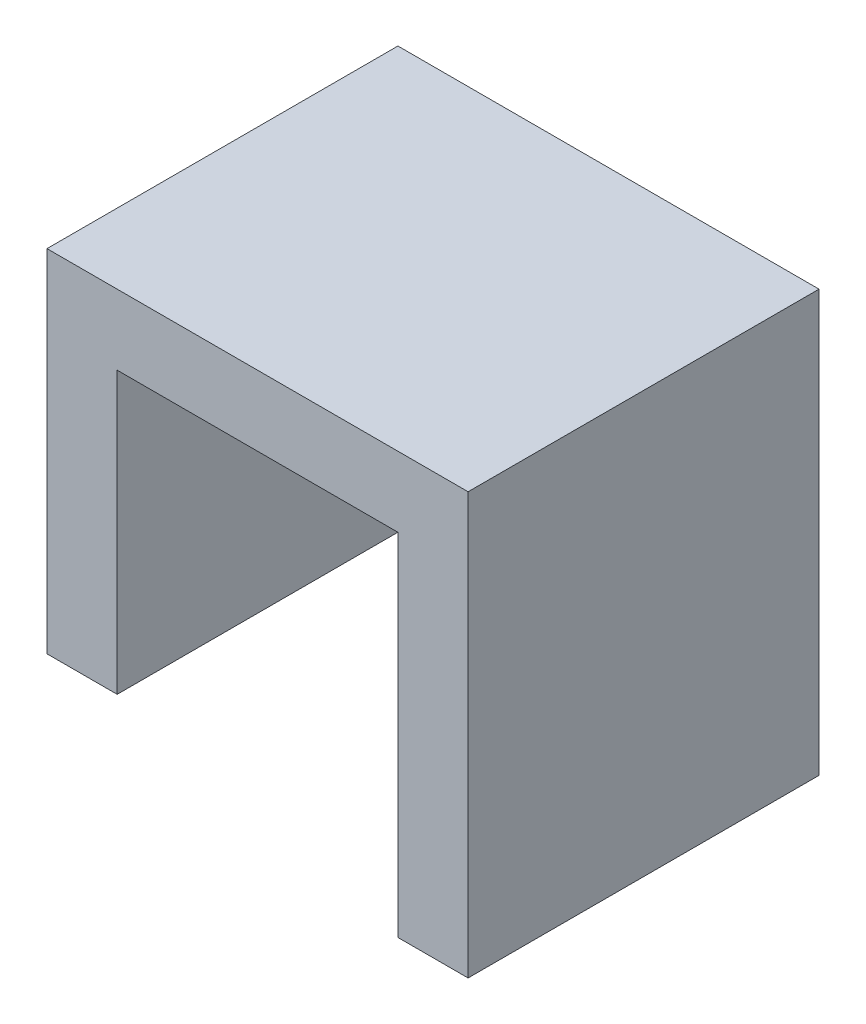
ISO-10303-21;
HEADER;
FILE_DESCRIPTION(('STEP AP214'),'2;1');
FILE_NAME('part.step','',(''),(''),'','','');
FILE_SCHEMA(('AUTOMOTIVE_DESIGN { 1 0 10303 214 1 1 1 1 }'));
ENDSEC;
DATA;
#1=APPLICATION_CONTEXT('core data for automotive mechanical design processes');
#2=APPLICATION_PROTOCOL_DEFINITION('international standard','automotive_design',2000,#1);
#3=PRODUCT_CONTEXT('',#1,'mechanical');
#4=PRODUCT('Part','Part','',(#3));
#5=PRODUCT_RELATED_PRODUCT_CATEGORY('part','',(#4));
#6=PRODUCT_DEFINITION_FORMATION('','',#4);
#7=PRODUCT_DEFINITION_CONTEXT('part definition',#1,'design');
#8=PRODUCT_DEFINITION('design','',#6,#7);
#9=PRODUCT_DEFINITION_SHAPE('','',#8);
#10=(LENGTH_UNIT() NAMED_UNIT(*) SI_UNIT(.MILLI.,.METRE.));
#11=(NAMED_UNIT(*) PLANE_ANGLE_UNIT() SI_UNIT($,.RADIAN.));
#12=(NAMED_UNIT(*) SI_UNIT($,.STERADIAN.) SOLID_ANGLE_UNIT());
#13=UNCERTAINTY_MEASURE_WITH_UNIT(LENGTH_MEASURE(1.E-05),#10,'distance_accuracy_value','');
#14=(GEOMETRIC_REPRESENTATION_CONTEXT(3) GLOBAL_UNCERTAINTY_ASSIGNED_CONTEXT((#13)) GLOBAL_UNIT_ASSIGNED_CONTEXT((#10,
#11,#12)) REPRESENTATION_CONTEXT('',''));
#15=CARTESIAN_POINT('',(0.,0.,0.));
#16=DIRECTION('',(0.,0.,1.));
#17=DIRECTION('',(1.,0.,0.));
#18=AXIS2_PLACEMENT_3D('',#15,#16,#17);
#19=CARTESIAN_POINT('',(8.87323943661972,8.,6.46478873239436));
#20=DIRECTION('',(0.,1.,0.));
#21=DIRECTION('',(0.,0.,1.));
#22=AXIS2_PLACEMENT_3D('',#19,#20,#21);
#23=PLANE('',#22);
#24=DIRECTION('',(0.,0.,-1.));
#25=VECTOR('',#24,1.);
#26=CARTESIAN_POINT('',(6.87323943661972,8.,6.46478873239436));
#27=LINE('',#26,#25);
#28=CARTESIAN_POINT('',(6.87323943661972,8.,6.46478873239436));
#29=VERTEX_POINT('',#28);
#30=CARTESIAN_POINT('',(6.87323943661972,8.,-3.53521126760564));
#31=VERTEX_POINT('',#30);
#32=EDGE_CURVE('E144',#29,#31,#27,.T.);
#33=ORIENTED_EDGE('',*,*,#32,.F.);
#34=DIRECTION('',(-1.,0.,0.));
#35=VECTOR('',#34,1.);
#36=CARTESIAN_POINT('',(8.87323943661972,8.,6.46478873239436));
#37=LINE('',#36,#35);
#38=CARTESIAN_POINT('',(-1.12676056338028,8.,6.46478873239436));
#39=VERTEX_POINT('',#38);
#40=EDGE_CURVE('E54',#29,#39,#37,.T.);
#41=ORIENTED_EDGE('',*,*,#40,.T.);
#42=DIRECTION('',(0.,0.,-1.));
#43=VECTOR('',#42,1.);
#44=CARTESIAN_POINT('',(-1.12676056338028,8.,6.46478873239436));
#45=LINE('',#44,#43);
#46=CARTESIAN_POINT('',(-1.12676056338029,8.,-3.53521126760564));
#47=VERTEX_POINT('',#46);
#48=EDGE_CURVE('E116',#39,#47,#45,.T.);
#49=ORIENTED_EDGE('',*,*,#48,.T.);
#50=DIRECTION('',(-1.,0.,0.));
#51=VECTOR('',#50,1.);
#52=CARTESIAN_POINT('',(8.87323943661971,8.,-3.53521126760564));
#53=LINE('',#52,#51);
#54=EDGE_CURVE('E107',#31,#47,#53,.T.);
#55=ORIENTED_EDGE('',*,*,#54,.F.);
#56=EDGE_LOOP('',(#33,#41,#49,#55));
#57=FACE_BOUND('',#56,.T.);
#58=ADVANCED_FACE('F39',(#57),#23,.F.);
#59=CARTESIAN_POINT('',(-1.12676056338029,10.,-3.53521126760564));
#60=DIRECTION('',(-1.,0.,0.));
#61=DIRECTION('',(0.,0.,1.));
#62=AXIS2_PLACEMENT_3D('',#59,#60,#61);
#63=PLANE('',#62);
#64=ORIENTED_EDGE('',*,*,#48,.F.);
#65=DIRECTION('',(0.,-1.,0.));
#66=VECTOR('',#65,1.);
#67=CARTESIAN_POINT('',(-1.12676056338028,10.,6.46478873239436));
#68=LINE('',#67,#66);
#69=CARTESIAN_POINT('',(-1.12676056338028,0.,6.46478873239436));
#70=VERTEX_POINT('',#69);
#71=EDGE_CURVE('E47',#39,#70,#68,.T.);
#72=ORIENTED_EDGE('',*,*,#71,.T.);
#73=DIRECTION('',(0.,0.,-1.));
#74=VECTOR('',#73,1.);
#75=CARTESIAN_POINT('',(-1.12676056338029,0.,-3.53521126760564));
#76=LINE('',#75,#74);
#77=CARTESIAN_POINT('',(-1.12676056338029,0.,-3.53521126760564));
#78=VERTEX_POINT('',#77);
#79=EDGE_CURVE('E95',#70,#78,#76,.T.);
#80=ORIENTED_EDGE('',*,*,#79,.T.);
#81=DIRECTION('',(0.,-1.,0.));
#82=VECTOR('',#81,1.);
#83=CARTESIAN_POINT('',(-1.12676056338029,10.,-3.53521126760564));
#84=LINE('',#83,#82);
#85=EDGE_CURVE('E89',#47,#78,#84,.T.);
#86=ORIENTED_EDGE('',*,*,#85,.F.);
#87=EDGE_LOOP('',(#64,#72,#80,#86));
#88=FACE_BOUND('',#87,.T.);
#89=ADVANCED_FACE('F115',(#88),#63,.F.);
#90=CARTESIAN_POINT('',(-3.12676056338029,10.,-3.53521126760564));
#91=DIRECTION('',(1.,0.,0.));
#92=DIRECTION('',(0.,0.,-1.));
#93=AXIS2_PLACEMENT_3D('',#90,#91,#92);
#94=PLANE('',#93);
#95=DIRECTION('',(0.,0.,1.));
#96=VECTOR('',#95,1.);
#97=CARTESIAN_POINT('',(-3.12676056338029,0.,-3.53521126760564));
#98=LINE('',#97,#96);
#99=CARTESIAN_POINT('',(-3.12676056338029,0.,-3.53521126760564));
#100=VERTEX_POINT('',#99);
#101=CARTESIAN_POINT('',(-3.12676056338028,0.,6.46478873239436));
#102=VERTEX_POINT('',#101);
#103=EDGE_CURVE('E100',#100,#102,#98,.T.);
#104=ORIENTED_EDGE('',*,*,#103,.T.);
#105=DIRECTION('',(0.,-1.,0.));
#106=VECTOR('',#105,1.);
#107=CARTESIAN_POINT('',(-3.12676056338028,10.,6.46478873239436));
#108=LINE('',#107,#106);
#109=CARTESIAN_POINT('',(-3.12676056338028,10.,6.46478873239436));
#110=VERTEX_POINT('',#109);
#111=EDGE_CURVE('E11',#110,#102,#108,.T.);
#112=ORIENTED_EDGE('',*,*,#111,.F.);
#113=DIRECTION('',(0.,0.,1.));
#114=VECTOR('',#113,1.);
#115=CARTESIAN_POINT('',(-3.12676056338029,10.,-3.53521126760564));
#116=LINE('',#115,#114);
#117=CARTESIAN_POINT('',(-3.12676056338029,10.,-3.53521126760564));
#118=VERTEX_POINT('',#117);
#119=EDGE_CURVE('E94',#118,#110,#116,.T.);
#120=ORIENTED_EDGE('',*,*,#119,.F.);
#121=DIRECTION('',(0.,-1.,0.));
#122=VECTOR('',#121,1.);
#123=CARTESIAN_POINT('',(-3.12676056338029,10.,-3.53521126760564));
#124=LINE('',#123,#122);
#125=EDGE_CURVE('E85',#118,#100,#124,.T.);
#126=ORIENTED_EDGE('',*,*,#125,.T.);
#127=EDGE_LOOP('',(#104,#112,#120,#126));
#128=FACE_BOUND('',#127,.T.);
#129=ADVANCED_FACE('F41',(#128),#94,.F.);
#130=CARTESIAN_POINT('',(-3.12676056338028,10.,6.46478873239436));
#131=DIRECTION('',(0.,0.,-1.));
#132=DIRECTION('',(-1.,0.,0.));
#133=AXIS2_PLACEMENT_3D('',#130,#131,#132);
#134=PLANE('',#133);
#135=DIRECTION('',(1.,0.,0.));
#136=VECTOR('',#135,1.);
#137=CARTESIAN_POINT('',(-3.12676056338028,0.,6.46478873239436));
#138=LINE('',#137,#136);
#139=EDGE_CURVE('E104',#102,#70,#138,.T.);
#140=ORIENTED_EDGE('',*,*,#139,.T.);
#141=ORIENTED_EDGE('',*,*,#71,.F.);
#142=ORIENTED_EDGE('',*,*,#40,.F.);
#143=DIRECTION('',(0.,1.,0.));
#144=VECTOR('',#143,1.);
#145=CARTESIAN_POINT('',(6.87323943661972,-2.,6.46478873239436));
#146=LINE('',#145,#144);
#147=CARTESIAN_POINT('',(6.87323943661972,-2.,6.46478873239436));
#148=VERTEX_POINT('',#147);
#149=EDGE_CURVE('E132',#148,#29,#146,.T.);
#150=ORIENTED_EDGE('',*,*,#149,.F.);
#151=DIRECTION('',(-1.,0.,0.));
#152=VECTOR('',#151,1.);
#153=CARTESIAN_POINT('',(8.87323943661972,-2.,6.46478873239436));
#154=LINE('',#153,#152);
#155=CARTESIAN_POINT('',(8.87323943661972,-2.,6.46478873239436));
#156=VERTEX_POINT('',#155);
#157=EDGE_CURVE('E147',#156,#148,#154,.T.);
#158=ORIENTED_EDGE('',*,*,#157,.F.);
#159=DIRECTION('',(0.,-1.,0.));
#160=VECTOR('',#159,1.);
#161=CARTESIAN_POINT('',(8.87323943661972,10.,6.46478873239436));
#162=LINE('',#161,#160);
#163=CARTESIAN_POINT('',(8.87323943661972,10.,6.46478873239436));
#164=VERTEX_POINT('',#163);
#165=EDGE_CURVE('E124',#164,#156,#162,.T.);
#166=ORIENTED_EDGE('',*,*,#165,.F.);
#167=DIRECTION('',(1.,0.,0.));
#168=VECTOR('',#167,1.);
#169=CARTESIAN_POINT('',(-3.12676056338028,10.,6.46478873239436));
#170=LINE('',#169,#168);
#171=EDGE_CURVE('E121',#110,#164,#170,.T.);
#172=ORIENTED_EDGE('',*,*,#171,.F.);
#173=ORIENTED_EDGE('',*,*,#111,.T.);
#174=EDGE_LOOP('',(#140,#141,#142,#150,#158,#166,#172,#173));
#175=FACE_BOUND('',#174,.T.);
#176=ADVANCED_FACE('F118',(#175),#134,.F.);
#177=CARTESIAN_POINT('',(-3.12676056338029,10.,-3.53521126760564));
#178=DIRECTION('',(0.,0.,1.));
#179=DIRECTION('',(1.,0.,0.));
#180=AXIS2_PLACEMENT_3D('',#177,#178,#179);
#181=PLANE('',#180);
#182=DIRECTION('',(-1.,0.,0.));
#183=VECTOR('',#182,1.);
#184=CARTESIAN_POINT('',(-3.12676056338029,0.,-3.53521126760564));
#185=LINE('',#184,#183);
#186=EDGE_CURVE('E82',#78,#100,#185,.T.);
#187=ORIENTED_EDGE('',*,*,#186,.T.);
#188=ORIENTED_EDGE('',*,*,#125,.F.);
#189=DIRECTION('',(-1.,0.,0.));
#190=VECTOR('',#189,1.);
#191=CARTESIAN_POINT('',(-3.12676056338029,10.,-3.53521126760564));
#192=LINE('',#191,#190);
#193=CARTESIAN_POINT('',(8.87323943661971,10.,-3.53521126760564));
#194=VERTEX_POINT('',#193);
#195=EDGE_CURVE('E63',#194,#118,#192,.T.);
#196=ORIENTED_EDGE('',*,*,#195,.F.);
#197=DIRECTION('',(0.,1.,0.));
#198=VECTOR('',#197,1.);
#199=CARTESIAN_POINT('',(8.87323943661971,10.,-3.53521126760564));
#200=LINE('',#199,#198);
#201=CARTESIAN_POINT('',(8.87323943661972,-2.,-3.53521126760564));
#202=VERTEX_POINT('',#201);
#203=EDGE_CURVE('E134',#202,#194,#200,.T.);
#204=ORIENTED_EDGE('',*,*,#203,.F.);
#205=DIRECTION('',(-1.,0.,0.));
#206=VECTOR('',#205,1.);
#207=CARTESIAN_POINT('',(8.87323943661972,-2.,-3.53521126760564));
#208=LINE('',#207,#206);
#209=CARTESIAN_POINT('',(6.87323943661972,-2.,-3.53521126760564));
#210=VERTEX_POINT('',#209);
#211=EDGE_CURVE('E150',#202,#210,#208,.T.);
#212=ORIENTED_EDGE('',*,*,#211,.T.);
#213=DIRECTION('',(0.,1.,0.));
#214=VECTOR('',#213,1.);
#215=CARTESIAN_POINT('',(6.87323943661972,-2.,-3.53521126760564));
#216=LINE('',#215,#214);
#217=EDGE_CURVE('E140',#210,#31,#216,.T.);
#218=ORIENTED_EDGE('',*,*,#217,.T.);
#219=ORIENTED_EDGE('',*,*,#54,.T.);
#220=ORIENTED_EDGE('',*,*,#85,.T.);
#221=EDGE_LOOP('',(#187,#188,#196,#204,#212,#218,#219,#220));
#222=FACE_BOUND('',#221,.T.);
#223=ADVANCED_FACE('F84',(#222),#181,.F.);
#224=CARTESIAN_POINT('',(0.,10.,0.));
#225=DIRECTION('',(0.,1.,0.));
#226=DIRECTION('',(0.,0.,1.));
#227=AXIS2_PLACEMENT_3D('',#224,#225,#226);
#228=PLANE('',#227);
#229=ORIENTED_EDGE('',*,*,#119,.T.);
#230=ORIENTED_EDGE('',*,*,#171,.T.);
#231=DIRECTION('',(0.,0.,1.));
#232=VECTOR('',#231,1.);
#233=CARTESIAN_POINT('',(8.87323943661972,10.,6.46478873239436));
#234=LINE('',#233,#232);
#235=EDGE_CURVE('E130',#194,#164,#234,.T.);
#236=ORIENTED_EDGE('',*,*,#235,.F.);
#237=ORIENTED_EDGE('',*,*,#195,.T.);
#238=EDGE_LOOP('',(#229,#230,#236,#237));
#239=FACE_BOUND('',#238,.T.);
#240=ADVANCED_FACE('F126',(#239),#228,.T.);
#241=CARTESIAN_POINT('',(0.,0.,0.));
#242=DIRECTION('',(0.,1.,0.));
#243=DIRECTION('',(0.,0.,1.));
#244=AXIS2_PLACEMENT_3D('',#241,#242,#243);
#245=PLANE('',#244);
#246=ORIENTED_EDGE('',*,*,#103,.F.);
#247=ORIENTED_EDGE('',*,*,#186,.F.);
#248=ORIENTED_EDGE('',*,*,#79,.F.);
#249=ORIENTED_EDGE('',*,*,#139,.F.);
#250=EDGE_LOOP('',(#246,#247,#248,#249));
#251=FACE_BOUND('',#250,.T.);
#252=ADVANCED_FACE('F102',(#251),#245,.F.);
#253=CARTESIAN_POINT('',(8.87323943661972,0.,0.));
#254=DIRECTION('',(1.,0.,0.));
#255=DIRECTION('',(0.,0.,-1.));
#256=AXIS2_PLACEMENT_3D('',#253,#254,#255);
#257=PLANE('',#256);
#258=ORIENTED_EDGE('',*,*,#165,.T.);
#259=DIRECTION('',(0.,0.,-1.));
#260=VECTOR('',#259,1.);
#261=CARTESIAN_POINT('',(8.87323943661972,-2.,6.46478873239436));
#262=LINE('',#261,#260);
#263=EDGE_CURVE('E143',#156,#202,#262,.T.);
#264=ORIENTED_EDGE('',*,*,#263,.T.);
#265=ORIENTED_EDGE('',*,*,#203,.T.);
#266=ORIENTED_EDGE('',*,*,#235,.T.);
#267=EDGE_LOOP('',(#258,#264,#265,#266));
#268=FACE_BOUND('',#267,.T.);
#269=ADVANCED_FACE('F185',(#268),#257,.T.);
#270=CARTESIAN_POINT('',(6.87323943661972,-2.,6.46478873239436));
#271=DIRECTION('',(1.,0.,0.));
#272=DIRECTION('',(0.,0.,-1.));
#273=AXIS2_PLACEMENT_3D('',#270,#271,#272);
#274=PLANE('',#273);
#275=ORIENTED_EDGE('',*,*,#32,.T.);
#276=ORIENTED_EDGE('',*,*,#217,.F.);
#277=DIRECTION('',(0.,0.,-1.));
#278=VECTOR('',#277,1.);
#279=CARTESIAN_POINT('',(6.87323943661972,-2.,6.46478873239436));
#280=LINE('',#279,#278);
#281=EDGE_CURVE('E153',#148,#210,#280,.T.);
#282=ORIENTED_EDGE('',*,*,#281,.F.);
#283=ORIENTED_EDGE('',*,*,#149,.T.);
#284=EDGE_LOOP('',(#275,#276,#282,#283));
#285=FACE_BOUND('',#284,.T.);
#286=ADVANCED_FACE('F171',(#285),#274,.F.);
#287=CARTESIAN_POINT('',(0.,-2.,0.));
#288=DIRECTION('',(0.,-1.,0.));
#289=DIRECTION('',(0.,0.,-1.));
#290=AXIS2_PLACEMENT_3D('',#287,#288,#289);
#291=PLANE('',#290);
#292=ORIENTED_EDGE('',*,*,#157,.T.);
#293=ORIENTED_EDGE('',*,*,#281,.T.);
#294=ORIENTED_EDGE('',*,*,#211,.F.);
#295=ORIENTED_EDGE('',*,*,#263,.F.);
#296=EDGE_LOOP('',(#292,#293,#294,#295));
#297=FACE_BOUND('',#296,.T.);
#298=ADVANCED_FACE('F161',(#297),#291,.T.);
#299=CLOSED_SHELL('',(#58,#89,#129,#176,#223,#240,#252,#269,#286,#298));
#300=MANIFOLD_SOLID_BREP('B2',#299);
#301=ADVANCED_BREP_SHAPE_REPRESENTATION('',(#18,#300),#14);
#302=SHAPE_DEFINITION_REPRESENTATION(#9,#301);
ENDSEC;
END-ISO-10303-21;
